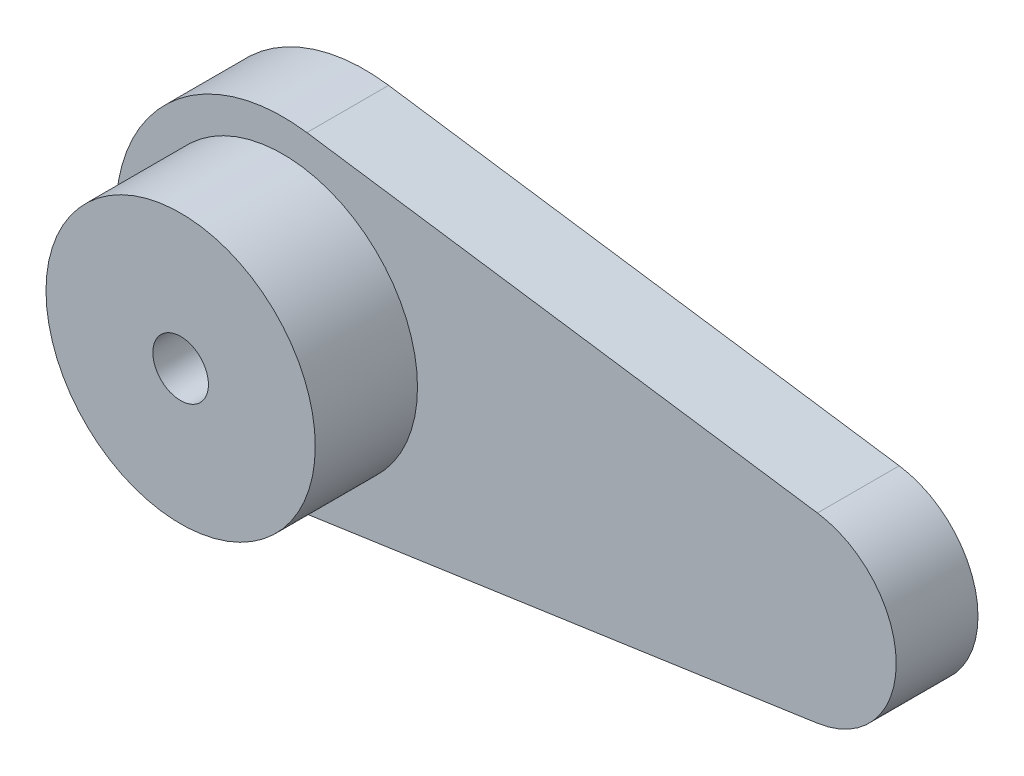
ISO-10303-21;
HEADER;
FILE_DESCRIPTION(('STEP AP214'),'2;1');
FILE_NAME('part.step','',(''),(''),'','','');
FILE_SCHEMA(('AUTOMOTIVE_DESIGN { 1 0 10303 214 1 1 1 1 }'));
ENDSEC;
DATA;
#1=APPLICATION_CONTEXT('core data for automotive mechanical design processes');
#2=APPLICATION_PROTOCOL_DEFINITION('international standard','automotive_design',2000,#1);
#3=PRODUCT_CONTEXT('',#1,'mechanical');
#4=PRODUCT('Part','Part','',(#3));
#5=PRODUCT_RELATED_PRODUCT_CATEGORY('part','',(#4));
#6=PRODUCT_DEFINITION_FORMATION('','',#4);
#7=PRODUCT_DEFINITION_CONTEXT('part definition',#1,'design');
#8=PRODUCT_DEFINITION('design','',#6,#7);
#9=PRODUCT_DEFINITION_SHAPE('','',#8);
#10=(LENGTH_UNIT() NAMED_UNIT(*) SI_UNIT(.MILLI.,.METRE.));
#11=(NAMED_UNIT(*) PLANE_ANGLE_UNIT() SI_UNIT($,.RADIAN.));
#12=(NAMED_UNIT(*) SI_UNIT($,.STERADIAN.) SOLID_ANGLE_UNIT());
#13=UNCERTAINTY_MEASURE_WITH_UNIT(LENGTH_MEASURE(1.E-05),#10,'distance_accuracy_value','');
#14=(GEOMETRIC_REPRESENTATION_CONTEXT(3) GLOBAL_UNCERTAINTY_ASSIGNED_CONTEXT((#13)) GLOBAL_UNIT_ASSIGNED_CONTEXT((#10,
#11,#12)) REPRESENTATION_CONTEXT('',''));
#15=CARTESIAN_POINT('',(0.,0.,0.));
#16=DIRECTION('',(0.,0.,1.));
#17=DIRECTION('',(1.,0.,0.));
#18=AXIS2_PLACEMENT_3D('',#15,#16,#17);
#19=CARTESIAN_POINT('',(0.,0.,5.));
#20=DIRECTION('',(0.,0.,-1.));
#21=DIRECTION('',(-1.,0.,0.));
#22=AXIS2_PLACEMENT_3D('',#19,#20,#21);
#23=CYLINDRICAL_SURFACE('',#22,8.165);
#24=CARTESIAN_POINT('',(0.,0.,1.));
#25=DIRECTION('',(0.,0.,-1.));
#26=DIRECTION('',(-1.,0.,0.));
#27=AXIS2_PLACEMENT_3D('',#24,#25,#26);
#28=CIRCLE('',#27,8.165);
#29=CARTESIAN_POINT('',(1.17351862745098,-8.08022765960375,1.));
#30=VERTEX_POINT('',#29);
#31=CARTESIAN_POINT('',(1.17351862745098,8.08022765960376,1.));
#32=VERTEX_POINT('',#31);
#33=EDGE_CURVE('E54',#30,#32,#28,.T.);
#34=ORIENTED_EDGE('',*,*,#33,.F.);
#35=DIRECTION('',(0.,0.,-1.));
#36=VECTOR('',#35,1.);
#37=CARTESIAN_POINT('',(1.17351862745098,-8.08022765960376,5.));
#38=LINE('',#37,#36);
#39=CARTESIAN_POINT('',(1.17351862745098,-8.08022765960376,5.));
#40=VERTEX_POINT('',#39);
#41=EDGE_CURVE('E192',#40,#30,#38,.T.);
#42=ORIENTED_EDGE('',*,*,#41,.F.);
#43=CARTESIAN_POINT('',(0.,0.,5.));
#44=DIRECTION('',(0.,0.,1.));
#45=DIRECTION('',(1.,0.,0.));
#46=AXIS2_PLACEMENT_3D('',#43,#44,#45);
#47=CIRCLE('',#46,8.165);
#48=CARTESIAN_POINT('',(1.17351862745098,8.08022765960376,5.));
#49=VERTEX_POINT('',#48);
#50=EDGE_CURVE('E431',#49,#40,#47,.T.);
#51=ORIENTED_EDGE('',*,*,#50,.F.);
#52=DIRECTION('',(0.,0.,-1.));
#53=VECTOR('',#52,1.);
#54=CARTESIAN_POINT('',(1.17351862745098,8.08022765960376,5.));
#55=LINE('',#54,#53);
#56=EDGE_CURVE('E200',#49,#32,#55,.T.);
#57=ORIENTED_EDGE('',*,*,#56,.T.);
#58=EDGE_LOOP('',(#34,#42,#51,#57));
#59=FACE_BOUND('',#58,.T.);
#60=ADVANCED_FACE('F39',(#59),#23,.T.);
#61=CARTESIAN_POINT('',(1.17351862745098,-8.08022765960376,5.));
#62=DIRECTION('',(-0.143725490196078,0.989617594562615,0.));
#63=DIRECTION('',(-0.989617594562615,-0.143725490196078,0.));
#64=AXIS2_PLACEMENT_3D('',#61,#62,#63);
#65=PLANE('',#64);
#66=DIRECTION('',(-0.989617594562615,-0.143725490196078,0.));
#67=VECTOR('',#66,1.);
#68=CARTESIAN_POINT('',(26.1467647058824,-4.45327917553177,1.));
#69=LINE('',#68,#67);
#70=CARTESIAN_POINT('',(26.1467647058824,-4.45327917553177,1.));
#71=VERTEX_POINT('',#70);
#72=EDGE_CURVE('E177',#71,#30,#69,.T.);
#73=ORIENTED_EDGE('',*,*,#72,.F.);
#74=DIRECTION('',(0.,0.,-1.));
#75=VECTOR('',#74,1.);
#76=CARTESIAN_POINT('',(26.1467647058824,-4.45327917553177,5.));
#77=LINE('',#76,#75);
#78=CARTESIAN_POINT('',(26.1467647058824,-4.45327917553177,5.));
#79=VERTEX_POINT('',#78);
#80=EDGE_CURVE('E189',#79,#71,#77,.T.);
#81=ORIENTED_EDGE('',*,*,#80,.F.);
#82=DIRECTION('',(0.989617594562615,0.143725490196078,0.));
#83=VECTOR('',#82,1.);
#84=CARTESIAN_POINT('',(1.17351862745098,-8.08022765960376,5.));
#85=LINE('',#84,#83);
#86=EDGE_CURVE('E436',#40,#79,#85,.T.);
#87=ORIENTED_EDGE('',*,*,#86,.F.);
#88=ORIENTED_EDGE('',*,*,#41,.T.);
#89=EDGE_LOOP('',(#73,#81,#87,#88));
#90=FACE_BOUND('',#89,.T.);
#91=ADVANCED_FACE('F188',(#90),#65,.F.);
#92=CARTESIAN_POINT('',(25.5,0.,5.));
#93=DIRECTION('',(0.,0.,-1.));
#94=DIRECTION('',(-1.,0.,0.));
#95=AXIS2_PLACEMENT_3D('',#92,#93,#94);
#96=CYLINDRICAL_SURFACE('',#95,4.5);
#97=CARTESIAN_POINT('',(25.5,0.,1.));
#98=DIRECTION('',(0.,0.,-1.));
#99=DIRECTION('',(-1.,0.,0.));
#100=AXIS2_PLACEMENT_3D('',#97,#98,#99);
#101=CIRCLE('',#100,4.5);
#102=CARTESIAN_POINT('',(26.1467647058824,4.45327917553177,1.));
#103=VERTEX_POINT('',#102);
#104=EDGE_CURVE('E174',#103,#71,#101,.T.);
#105=ORIENTED_EDGE('',*,*,#104,.F.);
#106=DIRECTION('',(0.,0.,-1.));
#107=VECTOR('',#106,1.);
#108=CARTESIAN_POINT('',(26.1467647058824,4.45327917553177,5.));
#109=LINE('',#108,#107);
#110=CARTESIAN_POINT('',(26.1467647058824,4.45327917553177,5.));
#111=VERTEX_POINT('',#110);
#112=EDGE_CURVE('E196',#111,#103,#109,.T.);
#113=ORIENTED_EDGE('',*,*,#112,.F.);
#114=CARTESIAN_POINT('',(25.5,0.,5.));
#115=DIRECTION('',(0.,0.,1.));
#116=DIRECTION('',(-1.,0.,0.));
#117=AXIS2_PLACEMENT_3D('',#114,#115,#116);
#118=CIRCLE('',#117,4.5);
#119=EDGE_CURVE('E195',#79,#111,#118,.T.);
#120=ORIENTED_EDGE('',*,*,#119,.F.);
#121=ORIENTED_EDGE('',*,*,#80,.T.);
#122=EDGE_LOOP('',(#105,#113,#120,#121));
#123=FACE_BOUND('',#122,.T.);
#124=ADVANCED_FACE('F194',(#123),#96,.T.);
#125=CARTESIAN_POINT('',(1.17351862745098,8.08022765960376,5.));
#126=DIRECTION('',(-0.143725490196078,-0.989617594562615,0.));
#127=DIRECTION('',(0.989617594562615,-0.143725490196078,0.));
#128=AXIS2_PLACEMENT_3D('',#125,#126,#127);
#129=PLANE('',#128);
#130=DIRECTION('',(0.989617594562615,-0.143725490196078,0.));
#131=VECTOR('',#130,1.);
#132=CARTESIAN_POINT('',(26.1467647058824,4.45327917553177,1.));
#133=LINE('',#132,#131);
#134=EDGE_CURVE('E178',#32,#103,#133,.T.);
#135=ORIENTED_EDGE('',*,*,#134,.F.);
#136=ORIENTED_EDGE('',*,*,#56,.F.);
#137=DIRECTION('',(-0.989617594562615,0.143725490196078,0.));
#138=VECTOR('',#137,1.);
#139=CARTESIAN_POINT('',(1.17351862745098,8.08022765960376,5.));
#140=LINE('',#139,#138);
#141=EDGE_CURVE('E439',#111,#49,#140,.T.);
#142=ORIENTED_EDGE('',*,*,#141,.F.);
#143=ORIENTED_EDGE('',*,*,#112,.T.);
#144=EDGE_LOOP('',(#135,#136,#142,#143));
#145=FACE_BOUND('',#144,.T.);
#146=ADVANCED_FACE('F240',(#145),#129,.F.);
#147=CARTESIAN_POINT('',(0.,0.,0.));
#148=DIRECTION('',(0.,0.,1.));
#149=DIRECTION('',(1.,0.,0.));
#150=AXIS2_PLACEMENT_3D('',#147,#148,#149);
#151=PLANE('',#150);
#152=CARTESIAN_POINT('',(0.,0.,0.));
#153=DIRECTION('',(0.,0.,1.));
#154=DIRECTION('',(1.,0.,0.));
#155=AXIS2_PLACEMENT_3D('',#152,#153,#154);
#156=CIRCLE('',#155,6.085);
#157=CARTESIAN_POINT('',(6.085,0.,0.));
#158=VERTEX_POINT('',#157);
#159=EDGE_CURVE('E47',#158,#158,#156,.F.);
#160=ORIENTED_EDGE('',*,*,#159,.T.);
#161=EDGE_LOOP('',(#160));
#162=FACE_BOUND('',#161,.T.);
#163=DIRECTION('',(-1.,0.,0.));
#164=VECTOR('',#163,1.);
#165=CARTESIAN_POINT('',(-4.185,-1.02,0.));
#166=LINE('',#165,#164);
#167=CARTESIAN_POINT('',(-3.165,-1.02,0.));
#168=VERTEX_POINT('',#167);
#169=CARTESIAN_POINT('',(-4.05879600374298,-1.02,0.));
#170=VERTEX_POINT('',#169);
#171=EDGE_CURVE('E363',#168,#170,#166,.T.);
#172=ORIENTED_EDGE('',*,*,#171,.T.);
#173=CARTESIAN_POINT('',(0.,0.,0.));
#174=DIRECTION('',(0.,0.,-1.));
#175=DIRECTION('',(-1.,0.,0.));
#176=AXIS2_PLACEMENT_3D('',#173,#174,#175);
#177=CIRCLE('',#176,4.185);
#178=CARTESIAN_POINT('',(-1.02,-4.05879600374298,0.));
#179=VERTEX_POINT('',#178);
#180=EDGE_CURVE('E62',#179,#170,#177,.T.);
#181=ORIENTED_EDGE('',*,*,#180,.F.);
#182=DIRECTION('',(0.,1.,0.));
#183=VECTOR('',#182,1.);
#184=CARTESIAN_POINT('',(-1.02,-4.185,0.));
#185=LINE('',#184,#183);
#186=CARTESIAN_POINT('',(-1.02,-3.165,0.));
#187=VERTEX_POINT('',#186);
#188=EDGE_CURVE('E359',#179,#187,#185,.T.);
#189=ORIENTED_EDGE('',*,*,#188,.T.);
#190=DIRECTION('',(1.,0.,0.));
#191=VECTOR('',#190,1.);
#192=CARTESIAN_POINT('',(-1.02,-3.165,0.));
#193=LINE('',#192,#191);
#194=CARTESIAN_POINT('',(1.02,-3.165,0.));
#195=VERTEX_POINT('',#194);
#196=EDGE_CURVE('E385',#187,#195,#193,.T.);
#197=ORIENTED_EDGE('',*,*,#196,.T.);
#198=DIRECTION('',(0.,-1.,0.));
#199=VECTOR('',#198,1.);
#200=CARTESIAN_POINT('',(1.02,-4.185,0.));
#201=LINE('',#200,#199);
#202=CARTESIAN_POINT('',(1.02,-4.05879600374298,0.));
#203=VERTEX_POINT('',#202);
#204=EDGE_CURVE('E380',#195,#203,#201,.T.);
#205=ORIENTED_EDGE('',*,*,#204,.T.);
#206=CARTESIAN_POINT('',(4.05879600374298,-1.02,0.));
#207=VERTEX_POINT('',#206);
#208=EDGE_CURVE('E427',#207,#203,#177,.T.);
#209=ORIENTED_EDGE('',*,*,#208,.F.);
#210=DIRECTION('',(-1.,0.,0.));
#211=VECTOR('',#210,1.);
#212=CARTESIAN_POINT('',(4.185,-1.02,0.));
#213=LINE('',#212,#211);
#214=CARTESIAN_POINT('',(3.165,-1.02,0.));
#215=VERTEX_POINT('',#214);
#216=EDGE_CURVE('E376',#207,#215,#213,.T.);
#217=ORIENTED_EDGE('',*,*,#216,.T.);
#218=DIRECTION('',(0.,1.,0.));
#219=VECTOR('',#218,1.);
#220=CARTESIAN_POINT('',(3.165,-1.02,0.));
#221=LINE('',#220,#219);
#222=CARTESIAN_POINT('',(3.165,1.02,0.));
#223=VERTEX_POINT('',#222);
#224=EDGE_CURVE('E400',#215,#223,#221,.T.);
#225=ORIENTED_EDGE('',*,*,#224,.T.);
#226=DIRECTION('',(1.,0.,0.));
#227=VECTOR('',#226,1.);
#228=CARTESIAN_POINT('',(4.185,1.02,0.));
#229=LINE('',#228,#227);
#230=CARTESIAN_POINT('',(4.05879600374298,1.02,0.));
#231=VERTEX_POINT('',#230);
#232=EDGE_CURVE('E395',#223,#231,#229,.T.);
#233=ORIENTED_EDGE('',*,*,#232,.T.);
#234=CARTESIAN_POINT('',(1.02,4.05879600374298,0.));
#235=VERTEX_POINT('',#234);
#236=EDGE_CURVE('E492',#235,#231,#177,.T.);
#237=ORIENTED_EDGE('',*,*,#236,.F.);
#238=DIRECTION('',(0.,-1.,0.));
#239=VECTOR('',#238,1.);
#240=CARTESIAN_POINT('',(1.02,4.185,0.));
#241=LINE('',#240,#239);
#242=CARTESIAN_POINT('',(1.02,3.165,0.));
#243=VERTEX_POINT('',#242);
#244=EDGE_CURVE('E341',#235,#243,#241,.T.);
#245=ORIENTED_EDGE('',*,*,#244,.T.);
#246=DIRECTION('',(-1.,0.,0.));
#247=VECTOR('',#246,1.);
#248=CARTESIAN_POINT('',(1.02,3.165,0.));
#249=LINE('',#248,#247);
#250=CARTESIAN_POINT('',(-1.02,3.165,0.));
#251=VERTEX_POINT('',#250);
#252=EDGE_CURVE('E343',#243,#251,#249,.T.);
#253=ORIENTED_EDGE('',*,*,#252,.T.);
#254=DIRECTION('',(0.,1.,0.));
#255=VECTOR('',#254,1.);
#256=CARTESIAN_POINT('',(-1.02,4.185,0.));
#257=LINE('',#256,#255);
#258=CARTESIAN_POINT('',(-1.02,4.05879600374298,0.));
#259=VERTEX_POINT('',#258);
#260=EDGE_CURVE('E347',#251,#259,#257,.T.);
#261=ORIENTED_EDGE('',*,*,#260,.T.);
#262=CARTESIAN_POINT('',(-4.05879600374298,1.02,0.));
#263=VERTEX_POINT('',#262);
#264=EDGE_CURVE('E424',#263,#259,#177,.T.);
#265=ORIENTED_EDGE('',*,*,#264,.F.);
#266=DIRECTION('',(1.,0.,0.));
#267=VECTOR('',#266,1.);
#268=CARTESIAN_POINT('',(-4.185,1.02,0.));
#269=LINE('',#268,#267);
#270=CARTESIAN_POINT('',(-3.165,1.02,0.));
#271=VERTEX_POINT('',#270);
#272=EDGE_CURVE('E344',#263,#271,#269,.T.);
#273=ORIENTED_EDGE('',*,*,#272,.T.);
#274=DIRECTION('',(0.,-1.,0.));
#275=VECTOR('',#274,1.);
#276=CARTESIAN_POINT('',(-3.165,1.02,0.));
#277=LINE('',#276,#275);
#278=EDGE_CURVE('E368',#271,#168,#277,.T.);
#279=ORIENTED_EDGE('',*,*,#278,.T.);
#280=EDGE_LOOP('',(#172,#181,#189,#197,#205,#209,#217,#225,#233,#237,#245,#253,#261,#265,#273,#279));
#281=FACE_BOUND('',#280,.T.);
#282=ADVANCED_FACE('F218',(#162,#281),#151,.F.);
#283=CARTESIAN_POINT('',(0.,0.,7.5));
#284=DIRECTION('',(0.,0.,-1.));
#285=DIRECTION('',(-1.,0.,0.));
#286=AXIS2_PLACEMENT_3D('',#283,#284,#285);
#287=CYLINDRICAL_SURFACE('',#286,4.185);
#288=CARTESIAN_POINT('',(0.,0.,7.5));
#289=DIRECTION('',(0.,0.,-1.));
#290=DIRECTION('',(-1.,0.,0.));
#291=AXIS2_PLACEMENT_3D('',#288,#289,#290);
#292=CIRCLE('',#291,4.185);
#293=CARTESIAN_POINT('',(1.02,4.05879600374298,7.5));
#294=VERTEX_POINT('',#293);
#295=CARTESIAN_POINT('',(4.05879600374298,1.02,7.5));
#296=VERTEX_POINT('',#295);
#297=EDGE_CURVE('E450',#294,#296,#292,.T.);
#298=ORIENTED_EDGE('',*,*,#297,.F.);
#299=DIRECTION('',(0.,0.,-1.));
#300=VECTOR('',#299,1.);
#301=CARTESIAN_POINT('',(1.02,4.05879600374298,7.5));
#302=LINE('',#301,#300);
#303=EDGE_CURVE('E418',#294,#235,#302,.T.);
#304=ORIENTED_EDGE('',*,*,#303,.T.);
#305=ORIENTED_EDGE('',*,*,#236,.T.);
#306=DIRECTION('',(0.,0.,-1.));
#307=VECTOR('',#306,1.);
#308=CARTESIAN_POINT('',(4.05879600374298,1.02,7.5));
#309=LINE('',#308,#307);
#310=EDGE_CURVE('E406',#231,#296,#309,.F.);
#311=ORIENTED_EDGE('',*,*,#310,.T.);
#312=EDGE_LOOP('',(#298,#304,#305,#311));
#313=FACE_BOUND('',#312,.T.);
#314=ADVANCED_FACE('F246',(#313),#287,.F.);
#315=ORIENTED_EDGE('',*,*,#180,.T.);
#316=DIRECTION('',(0.,0.,-1.));
#317=VECTOR('',#316,1.);
#318=CARTESIAN_POINT('',(-4.05879600374298,-1.02,7.5));
#319=LINE('',#318,#317);
#320=CARTESIAN_POINT('',(-4.05879600374298,-1.02,7.5));
#321=VERTEX_POINT('',#320);
#322=EDGE_CURVE('E414',#170,#321,#319,.F.);
#323=ORIENTED_EDGE('',*,*,#322,.T.);
#324=CARTESIAN_POINT('',(-1.02,-4.05879600374298,7.5));
#325=VERTEX_POINT('',#324);
#326=EDGE_CURVE('E420',#325,#321,#292,.T.);
#327=ORIENTED_EDGE('',*,*,#326,.F.);
#328=DIRECTION('',(0.,0.,-1.));
#329=VECTOR('',#328,1.);
#330=CARTESIAN_POINT('',(-1.02,-4.05879600374298,7.5));
#331=LINE('',#330,#329);
#332=EDGE_CURVE('E408',#325,#179,#331,.T.);
#333=ORIENTED_EDGE('',*,*,#332,.T.);
#334=EDGE_LOOP('',(#315,#323,#327,#333));
#335=FACE_BOUND('',#334,.T.);
#336=ADVANCED_FACE('F471',(#335),#287,.F.);
#337=ORIENTED_EDGE('',*,*,#208,.T.);
#338=DIRECTION('',(0.,0.,-1.));
#339=VECTOR('',#338,1.);
#340=CARTESIAN_POINT('',(1.02,-4.05879600374298,7.5));
#341=LINE('',#340,#339);
#342=CARTESIAN_POINT('',(1.02,-4.05879600374298,7.5));
#343=VERTEX_POINT('',#342);
#344=EDGE_CURVE('E410',#203,#343,#341,.F.);
#345=ORIENTED_EDGE('',*,*,#344,.T.);
#346=CARTESIAN_POINT('',(4.05879600374298,-1.02,7.5));
#347=VERTEX_POINT('',#346);
#348=EDGE_CURVE('E423',#347,#343,#292,.T.);
#349=ORIENTED_EDGE('',*,*,#348,.F.);
#350=DIRECTION('',(0.,0.,-1.));
#351=VECTOR('',#350,1.);
#352=CARTESIAN_POINT('',(4.05879600374298,-1.02,7.5));
#353=LINE('',#352,#351);
#354=EDGE_CURVE('E355',#347,#207,#353,.T.);
#355=ORIENTED_EDGE('',*,*,#354,.T.);
#356=EDGE_LOOP('',(#337,#345,#349,#355));
#357=FACE_BOUND('',#356,.T.);
#358=ADVANCED_FACE('F251',(#357),#287,.F.);
#359=CARTESIAN_POINT('',(0.,0.,5.));
#360=DIRECTION('',(0.,0.,1.));
#361=DIRECTION('',(1.,0.,0.));
#362=AXIS2_PLACEMENT_3D('',#359,#360,#361);
#363=PLANE('',#362);
#364=CARTESIAN_POINT('',(0.,0.,5.));
#365=DIRECTION('',(0.,0.,1.));
#366=DIRECTION('',(1.,0.,0.));
#367=AXIS2_PLACEMENT_3D('',#364,#365,#366);
#368=CIRCLE('',#367,6.585);
#369=CARTESIAN_POINT('',(6.585,0.,5.));
#370=VERTEX_POINT('',#369);
#371=EDGE_CURVE('E198',#370,#370,#368,.T.);
#372=ORIENTED_EDGE('',*,*,#371,.F.);
#373=EDGE_LOOP('',(#372));
#374=FACE_BOUND('',#373,.T.);
#375=ORIENTED_EDGE('',*,*,#50,.T.);
#376=ORIENTED_EDGE('',*,*,#86,.T.);
#377=ORIENTED_EDGE('',*,*,#119,.T.);
#378=ORIENTED_EDGE('',*,*,#141,.T.);
#379=EDGE_LOOP('',(#375,#376,#377,#378));
#380=FACE_BOUND('',#379,.T.);
#381=ADVANCED_FACE('F247',(#374,#380),#363,.T.);
#382=CARTESIAN_POINT('',(0.,0.,10.));
#383=DIRECTION('',(0.,0.,-1.));
#384=DIRECTION('',(-1.,0.,0.));
#385=AXIS2_PLACEMENT_3D('',#382,#383,#384);
#386=CYLINDRICAL_SURFACE('',#385,6.585);
#387=CARTESIAN_POINT('',(0.,0.,10.));
#388=DIRECTION('',(0.,0.,1.));
#389=DIRECTION('',(1.,0.,0.));
#390=AXIS2_PLACEMENT_3D('',#387,#388,#389);
#391=CIRCLE('',#390,6.585);
#392=CARTESIAN_POINT('',(6.585,0.,10.));
#393=VERTEX_POINT('',#392);
#394=EDGE_CURVE('E428',#393,#393,#391,.T.);
#395=ORIENTED_EDGE('',*,*,#394,.F.);
#396=EDGE_LOOP('',(#395));
#397=FACE_BOUND('',#396,.T.);
#398=ORIENTED_EDGE('',*,*,#371,.T.);
#399=EDGE_LOOP('',(#398));
#400=FACE_BOUND('',#399,.T.);
#401=ADVANCED_FACE('F250',(#397,#400),#386,.T.);
#402=CARTESIAN_POINT('',(0.,0.,10.));
#403=DIRECTION('',(0.,0.,1.));
#404=DIRECTION('',(1.,0.,0.));
#405=AXIS2_PLACEMENT_3D('',#402,#403,#404);
#406=PLANE('',#405);
#407=CARTESIAN_POINT('',(0.,0.,10.));
#408=DIRECTION('',(0.,0.,1.));
#409=DIRECTION('',(1.,0.,0.));
#410=AXIS2_PLACEMENT_3D('',#407,#408,#409);
#411=CIRCLE('',#410,1.36);
#412=CARTESIAN_POINT('',(1.36,0.,10.));
#413=VERTEX_POINT('',#412);
#414=EDGE_CURVE('E330',#413,#413,#411,.T.);
#415=ORIENTED_EDGE('',*,*,#414,.F.);
#416=EDGE_LOOP('',(#415));
#417=FACE_BOUND('',#416,.T.);
#418=ORIENTED_EDGE('',*,*,#394,.T.);
#419=EDGE_LOOP('',(#418));
#420=FACE_BOUND('',#419,.T.);
#421=ADVANCED_FACE('F255',(#417,#420),#406,.T.);
#422=ORIENTED_EDGE('',*,*,#264,.T.);
#423=DIRECTION('',(0.,0.,-1.));
#424=VECTOR('',#423,1.);
#425=CARTESIAN_POINT('',(-1.02,4.05879600374298,7.5));
#426=LINE('',#425,#424);
#427=CARTESIAN_POINT('',(-1.02,4.05879600374298,7.5));
#428=VERTEX_POINT('',#427);
#429=EDGE_CURVE('E416',#259,#428,#426,.F.);
#430=ORIENTED_EDGE('',*,*,#429,.T.);
#431=CARTESIAN_POINT('',(-4.05879600374298,1.02,7.5));
#432=VERTEX_POINT('',#431);
#433=EDGE_CURVE('E425',#432,#428,#292,.T.);
#434=ORIENTED_EDGE('',*,*,#433,.F.);
#435=DIRECTION('',(0.,0.,-1.));
#436=VECTOR('',#435,1.);
#437=CARTESIAN_POINT('',(-4.05879600374298,1.02,7.5));
#438=LINE('',#437,#436);
#439=EDGE_CURVE('E412',#432,#263,#438,.T.);
#440=ORIENTED_EDGE('',*,*,#439,.T.);
#441=EDGE_LOOP('',(#422,#430,#434,#440));
#442=FACE_BOUND('',#441,.T.);
#443=ADVANCED_FACE('F259',(#442),#287,.F.);
#444=CARTESIAN_POINT('',(0.,0.,7.5));
#445=DIRECTION('',(0.,0.,-1.));
#446=DIRECTION('',(-1.,0.,0.));
#447=AXIS2_PLACEMENT_3D('',#444,#445,#446);
#448=PLANE('',#447);
#449=CARTESIAN_POINT('',(0.,0.,7.5));
#450=DIRECTION('',(0.,0.,-1.));
#451=DIRECTION('',(-1.,0.,0.));
#452=AXIS2_PLACEMENT_3D('',#449,#450,#451);
#453=CIRCLE('',#452,1.36);
#454=CARTESIAN_POINT('',(-1.36,0.,7.5));
#455=VERTEX_POINT('',#454);
#456=EDGE_CURVE('E333',#455,#455,#453,.F.);
#457=ORIENTED_EDGE('',*,*,#456,.T.);
#458=EDGE_LOOP('',(#457));
#459=FACE_BOUND('',#458,.T.);
#460=DIRECTION('',(0.,1.,0.));
#461=VECTOR('',#460,1.);
#462=CARTESIAN_POINT('',(1.02,4.185,7.5));
#463=LINE('',#462,#461);
#464=CARTESIAN_POINT('',(1.02,3.165,7.5));
#465=VERTEX_POINT('',#464);
#466=EDGE_CURVE('E337',#465,#294,#463,.T.);
#467=ORIENTED_EDGE('',*,*,#466,.T.);
#468=ORIENTED_EDGE('',*,*,#297,.T.);
#469=DIRECTION('',(1.,0.,0.));
#470=VECTOR('',#469,1.);
#471=CARTESIAN_POINT('',(0.,1.02,7.5));
#472=LINE('',#471,#470);
#473=CARTESIAN_POINT('',(3.165,1.02,7.5));
#474=VERTEX_POINT('',#473);
#475=EDGE_CURVE('E204',#474,#296,#472,.T.);
#476=ORIENTED_EDGE('',*,*,#475,.F.);
#477=DIRECTION('',(0.,-1.,0.));
#478=VECTOR('',#477,1.);
#479=CARTESIAN_POINT('',(3.165,-1.02,7.5));
#480=LINE('',#479,#478);
#481=CARTESIAN_POINT('',(3.165,-1.02,7.5));
#482=VERTEX_POINT('',#481);
#483=EDGE_CURVE('E391',#474,#482,#480,.T.);
#484=ORIENTED_EDGE('',*,*,#483,.T.);
#485=DIRECTION('',(1.,0.,0.));
#486=VECTOR('',#485,1.);
#487=CARTESIAN_POINT('',(4.185,-1.02,7.5));
#488=LINE('',#487,#486);
#489=EDGE_CURVE('E336',#482,#347,#488,.T.);
#490=ORIENTED_EDGE('',*,*,#489,.T.);
#491=ORIENTED_EDGE('',*,*,#348,.T.);
#492=DIRECTION('',(0.,-1.,0.));
#493=VECTOR('',#492,1.);
#494=CARTESIAN_POINT('',(1.02,0.,7.5));
#495=LINE('',#494,#493);
#496=CARTESIAN_POINT('',(1.02,-3.165,7.5));
#497=VERTEX_POINT('',#496);
#498=EDGE_CURVE('E207',#497,#343,#495,.T.);
#499=ORIENTED_EDGE('',*,*,#498,.F.);
#500=DIRECTION('',(-1.,0.,0.));
#501=VECTOR('',#500,1.);
#502=CARTESIAN_POINT('',(-1.02,-3.165,7.5));
#503=LINE('',#502,#501);
#504=CARTESIAN_POINT('',(-1.02,-3.165,7.5));
#505=VERTEX_POINT('',#504);
#506=EDGE_CURVE('E375',#497,#505,#503,.T.);
#507=ORIENTED_EDGE('',*,*,#506,.T.);
#508=DIRECTION('',(0.,-1.,0.));
#509=VECTOR('',#508,1.);
#510=CARTESIAN_POINT('',(-1.02,-4.185,7.5));
#511=LINE('',#510,#509);
#512=EDGE_CURVE('E373',#505,#325,#511,.T.);
#513=ORIENTED_EDGE('',*,*,#512,.T.);
#514=ORIENTED_EDGE('',*,*,#326,.T.);
#515=DIRECTION('',(-1.,0.,0.));
#516=VECTOR('',#515,1.);
#517=CARTESIAN_POINT('',(0.,-1.02,7.5));
#518=LINE('',#517,#516);
#519=CARTESIAN_POINT('',(-3.165,-1.02,7.5));
#520=VERTEX_POINT('',#519);
#521=EDGE_CURVE('E210',#520,#321,#518,.T.);
#522=ORIENTED_EDGE('',*,*,#521,.F.);
#523=DIRECTION('',(0.,1.,0.));
#524=VECTOR('',#523,1.);
#525=CARTESIAN_POINT('',(-3.165,1.02,7.5));
#526=LINE('',#525,#524);
#527=CARTESIAN_POINT('',(-3.165,1.02,7.5));
#528=VERTEX_POINT('',#527);
#529=EDGE_CURVE('E358',#520,#528,#526,.T.);
#530=ORIENTED_EDGE('',*,*,#529,.T.);
#531=DIRECTION('',(-1.,0.,0.));
#532=VECTOR('',#531,1.);
#533=CARTESIAN_POINT('',(-4.185,1.02,7.5));
#534=LINE('',#533,#532);
#535=EDGE_CURVE('E356',#528,#432,#534,.T.);
#536=ORIENTED_EDGE('',*,*,#535,.T.);
#537=ORIENTED_EDGE('',*,*,#433,.T.);
#538=DIRECTION('',(0.,1.,0.));
#539=VECTOR('',#538,1.);
#540=CARTESIAN_POINT('',(-1.02,0.,7.5));
#541=LINE('',#540,#539);
#542=CARTESIAN_POINT('',(-1.02,3.165,7.5));
#543=VERTEX_POINT('',#542);
#544=EDGE_CURVE('E213',#543,#428,#541,.T.);
#545=ORIENTED_EDGE('',*,*,#544,.F.);
#546=DIRECTION('',(1.,0.,0.));
#547=VECTOR('',#546,1.);
#548=CARTESIAN_POINT('',(1.02,3.165,7.5));
#549=LINE('',#548,#547);
#550=EDGE_CURVE('E339',#543,#465,#549,.T.);
#551=ORIENTED_EDGE('',*,*,#550,.T.);
#552=EDGE_LOOP('',(#467,#468,#476,#484,#490,#491,#499,#507,#513,#514,#522,#530,#536,#537,#545,#551));
#553=FACE_BOUND('',#552,.T.);
#554=ADVANCED_FACE('F263',(#459,#553),#448,.T.);
#555=CARTESIAN_POINT('',(4.185,1.02,9.78078933704979));
#556=DIRECTION('',(0.,1.,0.));
#557=DIRECTION('',(-1.,0.,0.));
#558=AXIS2_PLACEMENT_3D('',#555,#556,#557);
#559=PLANE('',#558);
#560=ORIENTED_EDGE('',*,*,#310,.F.);
#561=ORIENTED_EDGE('',*,*,#232,.F.);
#562=DIRECTION('',(0.,0.,-1.));
#563=VECTOR('',#562,1.);
#564=CARTESIAN_POINT('',(3.165,1.02,9.78078933704979));
#565=LINE('',#564,#563);
#566=EDGE_CURVE('E396',#474,#223,#565,.T.);
#567=ORIENTED_EDGE('',*,*,#566,.F.);
#568=ORIENTED_EDGE('',*,*,#475,.T.);
#569=EDGE_LOOP('',(#560,#561,#567,#568));
#570=FACE_BOUND('',#569,.T.);
#571=ADVANCED_FACE('F267',(#570),#559,.T.);
#572=CARTESIAN_POINT('',(4.185,-1.02,9.78078933704979));
#573=DIRECTION('',(0.,-1.,0.));
#574=DIRECTION('',(1.,0.,0.));
#575=AXIS2_PLACEMENT_3D('',#572,#573,#574);
#576=PLANE('',#575);
#577=ORIENTED_EDGE('',*,*,#354,.F.);
#578=ORIENTED_EDGE('',*,*,#489,.F.);
#579=DIRECTION('',(0.,0.,-1.));
#580=VECTOR('',#579,1.);
#581=CARTESIAN_POINT('',(3.165,-1.02,9.78078933704979));
#582=LINE('',#581,#580);
#583=EDGE_CURVE('E392',#482,#215,#582,.T.);
#584=ORIENTED_EDGE('',*,*,#583,.T.);
#585=ORIENTED_EDGE('',*,*,#216,.F.);
#586=EDGE_LOOP('',(#577,#578,#584,#585));
#587=FACE_BOUND('',#586,.T.);
#588=ADVANCED_FACE('F271',(#587),#576,.T.);
#589=CARTESIAN_POINT('',(3.165,-1.02,9.78078933704979));
#590=DIRECTION('',(-1.,0.,0.));
#591=DIRECTION('',(0.,0.,1.));
#592=AXIS2_PLACEMENT_3D('',#589,#590,#591);
#593=PLANE('',#592);
#594=ORIENTED_EDGE('',*,*,#483,.F.);
#595=ORIENTED_EDGE('',*,*,#566,.T.);
#596=ORIENTED_EDGE('',*,*,#224,.F.);
#597=ORIENTED_EDGE('',*,*,#583,.F.);
#598=EDGE_LOOP('',(#594,#595,#596,#597));
#599=FACE_BOUND('',#598,.T.);
#600=ADVANCED_FACE('F273',(#599),#593,.T.);
#601=CARTESIAN_POINT('',(1.02,-4.185,9.78078933704979));
#602=DIRECTION('',(1.,0.,0.));
#603=DIRECTION('',(0.,0.,-1.));
#604=AXIS2_PLACEMENT_3D('',#601,#602,#603);
#605=PLANE('',#604);
#606=ORIENTED_EDGE('',*,*,#344,.F.);
#607=ORIENTED_EDGE('',*,*,#204,.F.);
#608=DIRECTION('',(0.,0.,-1.));
#609=VECTOR('',#608,1.);
#610=CARTESIAN_POINT('',(1.02,-3.165,9.78078933704979));
#611=LINE('',#610,#609);
#612=EDGE_CURVE('E381',#497,#195,#611,.T.);
#613=ORIENTED_EDGE('',*,*,#612,.F.);
#614=ORIENTED_EDGE('',*,*,#498,.T.);
#615=EDGE_LOOP('',(#606,#607,#613,#614));
#616=FACE_BOUND('',#615,.T.);
#617=ADVANCED_FACE('F276',(#616),#605,.T.);
#618=CARTESIAN_POINT('',(-1.02,-4.185,9.78078933704979));
#619=DIRECTION('',(-1.,0.,0.));
#620=DIRECTION('',(0.,0.,1.));
#621=AXIS2_PLACEMENT_3D('',#618,#619,#620);
#622=PLANE('',#621);
#623=ORIENTED_EDGE('',*,*,#332,.F.);
#624=ORIENTED_EDGE('',*,*,#512,.F.);
#625=DIRECTION('',(0.,0.,-1.));
#626=VECTOR('',#625,1.);
#627=CARTESIAN_POINT('',(-1.02,-3.165,9.78078933704979));
#628=LINE('',#627,#626);
#629=EDGE_CURVE('E377',#505,#187,#628,.T.);
#630=ORIENTED_EDGE('',*,*,#629,.T.);
#631=ORIENTED_EDGE('',*,*,#188,.F.);
#632=EDGE_LOOP('',(#623,#624,#630,#631));
#633=FACE_BOUND('',#632,.T.);
#634=ADVANCED_FACE('F283',(#633),#622,.T.);
#635=CARTESIAN_POINT('',(-1.02,-3.165,9.78078933704979));
#636=DIRECTION('',(0.,1.,0.));
#637=DIRECTION('',(0.,0.,1.));
#638=AXIS2_PLACEMENT_3D('',#635,#636,#637);
#639=PLANE('',#638);
#640=ORIENTED_EDGE('',*,*,#506,.F.);
#641=ORIENTED_EDGE('',*,*,#612,.T.);
#642=ORIENTED_EDGE('',*,*,#196,.F.);
#643=ORIENTED_EDGE('',*,*,#629,.F.);
#644=EDGE_LOOP('',(#640,#641,#642,#643));
#645=FACE_BOUND('',#644,.T.);
#646=ADVANCED_FACE('F285',(#645),#639,.T.);
#647=CARTESIAN_POINT('',(-4.185,-1.02,9.78078933704979));
#648=DIRECTION('',(0.,-1.,0.));
#649=DIRECTION('',(1.,0.,0.));
#650=AXIS2_PLACEMENT_3D('',#647,#648,#649);
#651=PLANE('',#650);
#652=ORIENTED_EDGE('',*,*,#322,.F.);
#653=ORIENTED_EDGE('',*,*,#171,.F.);
#654=DIRECTION('',(0.,0.,-1.));
#655=VECTOR('',#654,1.);
#656=CARTESIAN_POINT('',(-3.165,-1.02,9.78078933704979));
#657=LINE('',#656,#655);
#658=EDGE_CURVE('E364',#520,#168,#657,.T.);
#659=ORIENTED_EDGE('',*,*,#658,.F.);
#660=ORIENTED_EDGE('',*,*,#521,.T.);
#661=EDGE_LOOP('',(#652,#653,#659,#660));
#662=FACE_BOUND('',#661,.T.);
#663=ADVANCED_FACE('F288',(#662),#651,.T.);
#664=CARTESIAN_POINT('',(-4.185,1.02,9.78078933704979));
#665=DIRECTION('',(0.,1.,0.));
#666=DIRECTION('',(-1.,0.,0.));
#667=AXIS2_PLACEMENT_3D('',#664,#665,#666);
#668=PLANE('',#667);
#669=ORIENTED_EDGE('',*,*,#439,.F.);
#670=ORIENTED_EDGE('',*,*,#535,.F.);
#671=DIRECTION('',(0.,0.,-1.));
#672=VECTOR('',#671,1.);
#673=CARTESIAN_POINT('',(-3.165,1.02,9.78078933704979));
#674=LINE('',#673,#672);
#675=EDGE_CURVE('E360',#528,#271,#674,.T.);
#676=ORIENTED_EDGE('',*,*,#675,.T.);
#677=ORIENTED_EDGE('',*,*,#272,.F.);
#678=EDGE_LOOP('',(#669,#670,#676,#677));
#679=FACE_BOUND('',#678,.T.);
#680=ADVANCED_FACE('F295',(#679),#668,.T.);
#681=CARTESIAN_POINT('',(-3.165,1.02,9.78078933704979));
#682=DIRECTION('',(1.,0.,0.));
#683=DIRECTION('',(0.,0.,-1.));
#684=AXIS2_PLACEMENT_3D('',#681,#682,#683);
#685=PLANE('',#684);
#686=ORIENTED_EDGE('',*,*,#529,.F.);
#687=ORIENTED_EDGE('',*,*,#658,.T.);
#688=ORIENTED_EDGE('',*,*,#278,.F.);
#689=ORIENTED_EDGE('',*,*,#675,.F.);
#690=EDGE_LOOP('',(#686,#687,#688,#689));
#691=FACE_BOUND('',#690,.T.);
#692=ADVANCED_FACE('F297',(#691),#685,.T.);
#693=CARTESIAN_POINT('',(1.02,4.185,9.78078933704979));
#694=DIRECTION('',(1.,0.,0.));
#695=DIRECTION('',(0.,0.,-1.));
#696=AXIS2_PLACEMENT_3D('',#693,#694,#695);
#697=PLANE('',#696);
#698=ORIENTED_EDGE('',*,*,#303,.F.);
#699=ORIENTED_EDGE('',*,*,#466,.F.);
#700=DIRECTION('',(0.,0.,-1.));
#701=VECTOR('',#700,1.);
#702=CARTESIAN_POINT('',(1.02,3.165,9.78078933704979));
#703=LINE('',#702,#701);
#704=EDGE_CURVE('E350',#465,#243,#703,.T.);
#705=ORIENTED_EDGE('',*,*,#704,.T.);
#706=ORIENTED_EDGE('',*,*,#244,.F.);
#707=EDGE_LOOP('',(#698,#699,#705,#706));
#708=FACE_BOUND('',#707,.T.);
#709=ADVANCED_FACE('F300',(#708),#697,.T.);
#710=CARTESIAN_POINT('',(-1.02,4.185,9.78078933704979));
#711=DIRECTION('',(-1.,0.,0.));
#712=DIRECTION('',(0.,0.,1.));
#713=AXIS2_PLACEMENT_3D('',#710,#711,#712);
#714=PLANE('',#713);
#715=ORIENTED_EDGE('',*,*,#429,.F.);
#716=ORIENTED_EDGE('',*,*,#260,.F.);
#717=DIRECTION('',(0.,0.,-1.));
#718=VECTOR('',#717,1.);
#719=CARTESIAN_POINT('',(-1.02,3.165,9.78078933704979));
#720=LINE('',#719,#718);
#721=EDGE_CURVE('E340',#543,#251,#720,.T.);
#722=ORIENTED_EDGE('',*,*,#721,.F.);
#723=ORIENTED_EDGE('',*,*,#544,.T.);
#724=EDGE_LOOP('',(#715,#716,#722,#723));
#725=FACE_BOUND('',#724,.T.);
#726=ADVANCED_FACE('F307',(#725),#714,.T.);
#727=CARTESIAN_POINT('',(1.02,3.165,9.78078933704979));
#728=DIRECTION('',(0.,-1.,0.));
#729=DIRECTION('',(0.,0.,-1.));
#730=AXIS2_PLACEMENT_3D('',#727,#728,#729);
#731=PLANE('',#730);
#732=ORIENTED_EDGE('',*,*,#550,.F.);
#733=ORIENTED_EDGE('',*,*,#721,.T.);
#734=ORIENTED_EDGE('',*,*,#252,.F.);
#735=ORIENTED_EDGE('',*,*,#704,.F.);
#736=EDGE_LOOP('',(#732,#733,#734,#735));
#737=FACE_BOUND('',#736,.T.);
#738=ADVANCED_FACE('F309',(#737),#731,.T.);
#739=CARTESIAN_POINT('',(0.,0.,3.65333911034518));
#740=DIRECTION('',(0.,0.,1.));
#741=DIRECTION('',(1.,0.,0.));
#742=AXIS2_PLACEMENT_3D('',#739,#740,#741);
#743=CYLINDRICAL_SURFACE('',#742,1.36);
#744=ORIENTED_EDGE('',*,*,#414,.T.);
#745=EDGE_LOOP('',(#744));
#746=FACE_BOUND('',#745,.T.);
#747=ORIENTED_EDGE('',*,*,#456,.F.);
#748=EDGE_LOOP('',(#747));
#749=FACE_BOUND('',#748,.T.);
#750=ADVANCED_FACE('F312',(#746,#749),#743,.F.);
#751=CARTESIAN_POINT('',(25.5,0.,1.));
#752=DIRECTION('',(0.,0.,-1.));
#753=DIRECTION('',(-1.,0.,0.));
#754=AXIS2_PLACEMENT_3D('',#751,#752,#753);
#755=PLANE('',#754);
#756=CARTESIAN_POINT('',(0.,0.,1.));
#757=DIRECTION('',(0.,0.,-1.));
#758=DIRECTION('',(-1.,0.,0.));
#759=AXIS2_PLACEMENT_3D('',#756,#757,#758);
#760=CIRCLE('',#759,6.585);
#761=CARTESIAN_POINT('',(-6.585,0.,1.));
#762=VERTEX_POINT('',#761);
#763=EDGE_CURVE('E183',#762,#762,#760,.T.);
#764=ORIENTED_EDGE('',*,*,#763,.F.);
#765=EDGE_LOOP('',(#764));
#766=FACE_BOUND('',#765,.T.);
#767=ORIENTED_EDGE('',*,*,#104,.T.);
#768=ORIENTED_EDGE('',*,*,#72,.T.);
#769=ORIENTED_EDGE('',*,*,#33,.T.);
#770=ORIENTED_EDGE('',*,*,#134,.T.);
#771=EDGE_LOOP('',(#767,#768,#769,#770));
#772=FACE_BOUND('',#771,.T.);
#773=ADVANCED_FACE('F176',(#766,#772),#755,.T.);
#774=CARTESIAN_POINT('',(0.,0.,1.));
#775=DIRECTION('',(0.,0.,-1.));
#776=DIRECTION('',(-1.,0.,0.));
#777=AXIS2_PLACEMENT_3D('',#774,#775,#776);
#778=CYLINDRICAL_SURFACE('',#777,6.585);
#779=CARTESIAN_POINT('',(0.,0.,0.5));
#780=DIRECTION('',(0.,0.,1.));
#781=DIRECTION('',(1.,0.,0.));
#782=AXIS2_PLACEMENT_3D('',#779,#780,#781);
#783=CIRCLE('',#782,6.585);
#784=CARTESIAN_POINT('',(6.585,0.,0.5));
#785=VERTEX_POINT('',#784);
#786=EDGE_CURVE('E11',#785,#785,#783,.T.);
#787=ORIENTED_EDGE('',*,*,#786,.T.);
#788=EDGE_LOOP('',(#787));
#789=FACE_BOUND('',#788,.T.);
#790=ORIENTED_EDGE('',*,*,#763,.T.);
#791=EDGE_LOOP('',(#790));
#792=FACE_BOUND('',#791,.T.);
#793=ADVANCED_FACE('F222',(#789,#792),#778,.T.);
#794=CARTESIAN_POINT('',(0.,0.,0.5));
#795=DIRECTION('',(0.,0.,1.));
#796=DIRECTION('',(1.,0.,0.));
#797=AXIS2_PLACEMENT_3D('',#794,#795,#796);
#798=TOROIDAL_SURFACE('',#797,6.085,0.5);
#799=ORIENTED_EDGE('',*,*,#786,.F.);
#800=EDGE_LOOP('',(#799));
#801=FACE_BOUND('',#800,.T.);
#802=ORIENTED_EDGE('',*,*,#159,.F.);
#803=EDGE_LOOP('',(#802));
#804=FACE_BOUND('',#803,.T.);
#805=ADVANCED_FACE('F41',(#801,#804),#798,.T.);
#806=CLOSED_SHELL('',(#60,#91,#124,#146,#282,#314,#336,#358,#381,#401,#421,#443,#554,#571,#588,
#600,#617,#634,#646,#663,#680,#692,#709,#726,#738,#750,#773,#793,#805));
#807=MANIFOLD_SOLID_BREP('B2',#806);
#808=ADVANCED_BREP_SHAPE_REPRESENTATION('',(#18,#807),#14);
#809=SHAPE_DEFINITION_REPRESENTATION(#9,#808);
ENDSEC;
END-ISO-10303-21;
